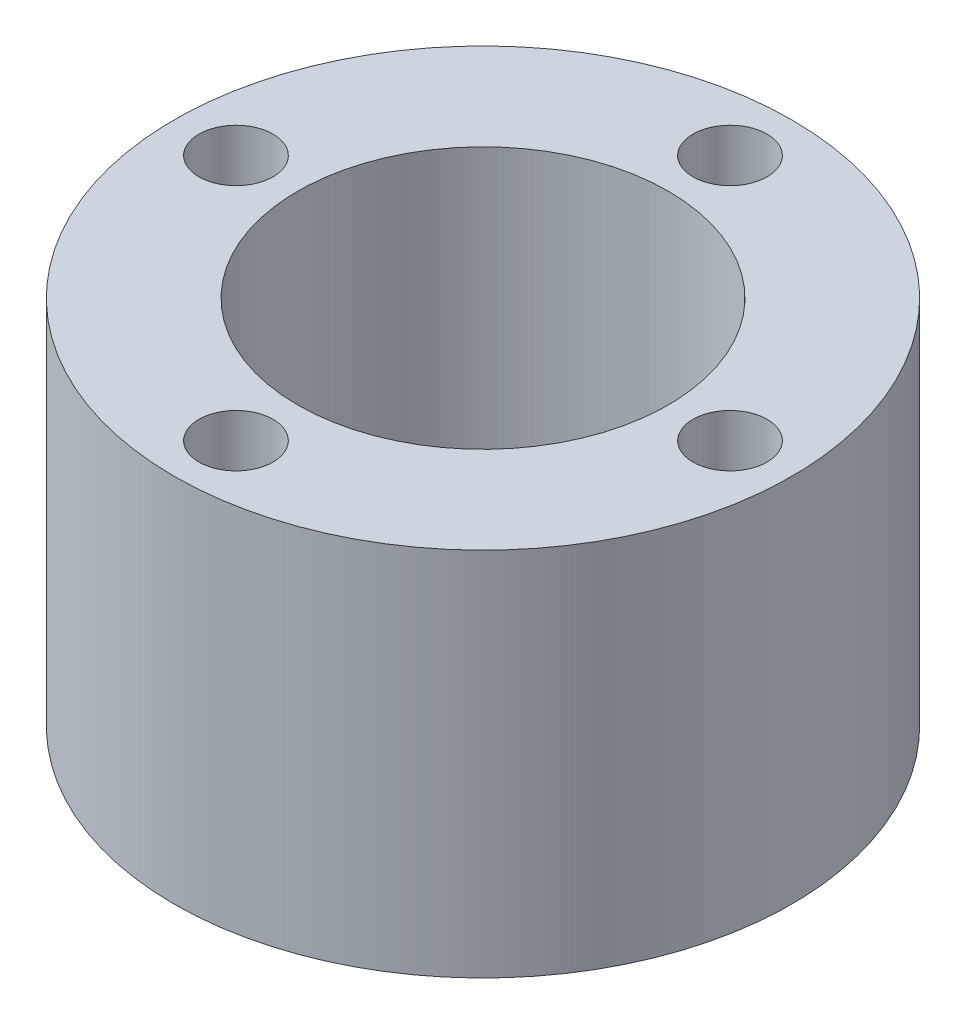
ISO-10303-21;
HEADER;
FILE_DESCRIPTION(('STEP AP214'),'2;1');
FILE_NAME('part.step','',(''),(''),'','','');
FILE_SCHEMA(('AUTOMOTIVE_DESIGN { 1 0 10303 214 1 1 1 1 }'));
ENDSEC;
DATA;
#1=APPLICATION_CONTEXT('core data for automotive mechanical design processes');
#2=APPLICATION_PROTOCOL_DEFINITION('international standard','automotive_design',2000,#1);
#3=PRODUCT_CONTEXT('',#1,'mechanical');
#4=PRODUCT('Part','Part','',(#3));
#5=PRODUCT_RELATED_PRODUCT_CATEGORY('part','',(#4));
#6=PRODUCT_DEFINITION_FORMATION('','',#4);
#7=PRODUCT_DEFINITION_CONTEXT('part definition',#1,'design');
#8=PRODUCT_DEFINITION('design','',#6,#7);
#9=PRODUCT_DEFINITION_SHAPE('','',#8);
#10=(LENGTH_UNIT() NAMED_UNIT(*) SI_UNIT(.MILLI.,.METRE.));
#11=(NAMED_UNIT(*) PLANE_ANGLE_UNIT() SI_UNIT($,.RADIAN.));
#12=(NAMED_UNIT(*) SI_UNIT($,.STERADIAN.) SOLID_ANGLE_UNIT());
#13=UNCERTAINTY_MEASURE_WITH_UNIT(LENGTH_MEASURE(1.E-05),#10,'distance_accuracy_value','');
#14=(GEOMETRIC_REPRESENTATION_CONTEXT(3) GLOBAL_UNCERTAINTY_ASSIGNED_CONTEXT((#13)) GLOBAL_UNIT_ASSIGNED_CONTEXT((#10,
#11,#12)) REPRESENTATION_CONTEXT('',''));
#15=CARTESIAN_POINT('',(0.,0.,0.));
#16=DIRECTION('',(0.,0.,1.));
#17=DIRECTION('',(1.,0.,0.));
#18=AXIS2_PLACEMENT_3D('',#15,#16,#17);
#19=CARTESIAN_POINT('',(0.,30.,0.));
#20=DIRECTION('',(0.,1.,0.));
#21=DIRECTION('',(0.,0.,1.));
#22=AXIS2_PLACEMENT_3D('',#19,#20,#21);
#23=PLANE('',#22);
#24=CARTESIAN_POINT('',(-20.,30.,0.));
#25=DIRECTION('',(0.,1.,0.));
#26=DIRECTION('',(0.,0.,1.));
#27=AXIS2_PLACEMENT_3D('',#24,#25,#26);
#28=CIRCLE('',#27,3.);
#29=CARTESIAN_POINT('',(-20.,30.,3.));
#30=VERTEX_POINT('',#29);
#31=EDGE_CURVE('E84',#30,#30,#28,.T.);
#32=ORIENTED_EDGE('',*,*,#31,.F.);
#33=EDGE_LOOP('',(#32));
#34=FACE_BOUND('',#33,.T.);
#35=CARTESIAN_POINT('',(0.,30.,-20.));
#36=DIRECTION('',(0.,1.,0.));
#37=DIRECTION('',(0.,0.,1.));
#38=AXIS2_PLACEMENT_3D('',#35,#36,#37);
#39=CIRCLE('',#38,3.);
#40=CARTESIAN_POINT('',(0.,30.,-17.));
#41=VERTEX_POINT('',#40);
#42=EDGE_CURVE('E80',#41,#41,#39,.T.);
#43=ORIENTED_EDGE('',*,*,#42,.F.);
#44=EDGE_LOOP('',(#43));
#45=FACE_BOUND('',#44,.T.);
#46=CARTESIAN_POINT('',(20.,30.,0.));
#47=DIRECTION('',(0.,1.,0.));
#48=DIRECTION('',(0.,0.,1.));
#49=AXIS2_PLACEMENT_3D('',#46,#47,#48);
#50=CIRCLE('',#49,3.);
#51=CARTESIAN_POINT('',(20.,30.,3.));
#52=VERTEX_POINT('',#51);
#53=EDGE_CURVE('E72',#52,#52,#50,.T.);
#54=ORIENTED_EDGE('',*,*,#53,.F.);
#55=EDGE_LOOP('',(#54));
#56=FACE_BOUND('',#55,.T.);
#57=CARTESIAN_POINT('',(0.,30.,20.));
#58=DIRECTION('',(0.,1.,0.));
#59=DIRECTION('',(0.,0.,1.));
#60=AXIS2_PLACEMENT_3D('',#57,#58,#59);
#61=CIRCLE('',#60,3.);
#62=CARTESIAN_POINT('',(0.,30.,23.));
#63=VERTEX_POINT('',#62);
#64=EDGE_CURVE('E64',#63,#63,#61,.T.);
#65=ORIENTED_EDGE('',*,*,#64,.F.);
#66=EDGE_LOOP('',(#65));
#67=FACE_BOUND('',#66,.T.);
#68=CARTESIAN_POINT('',(0.,30.,0.));
#69=DIRECTION('',(0.,1.,0.));
#70=DIRECTION('',(0.,0.,1.));
#71=AXIS2_PLACEMENT_3D('',#68,#69,#70);
#72=CIRCLE('',#71,25.);
#73=CARTESIAN_POINT('',(0.,30.,25.));
#74=VERTEX_POINT('',#73);
#75=EDGE_CURVE('E10',#74,#74,#72,.T.);
#76=ORIENTED_EDGE('',*,*,#75,.T.);
#77=EDGE_LOOP('',(#76));
#78=FACE_BOUND('',#77,.T.);
#79=CARTESIAN_POINT('',(0.,30.,0.));
#80=DIRECTION('',(0.,1.,0.));
#81=DIRECTION('',(0.,0.,1.));
#82=AXIS2_PLACEMENT_3D('',#79,#80,#81);
#83=CIRCLE('',#82,15.);
#84=CARTESIAN_POINT('',(0.,30.,15.));
#85=VERTEX_POINT('',#84);
#86=EDGE_CURVE('E50',#85,#85,#83,.T.);
#87=ORIENTED_EDGE('',*,*,#86,.F.);
#88=EDGE_LOOP('',(#87));
#89=FACE_BOUND('',#88,.T.);
#90=ADVANCED_FACE('F37',(#34,#45,#56,#67,#78,#89),#23,.T.);
#91=CARTESIAN_POINT('',(0.,0.,0.));
#92=DIRECTION('',(0.,1.,0.));
#93=DIRECTION('',(0.,0.,1.));
#94=AXIS2_PLACEMENT_3D('',#91,#92,#93);
#95=PLANE('',#94);
#96=CARTESIAN_POINT('',(-20.,0.,0.));
#97=DIRECTION('',(0.,1.,0.));
#98=DIRECTION('',(0.,0.,1.));
#99=AXIS2_PLACEMENT_3D('',#96,#97,#98);
#100=CIRCLE('',#99,3.);
#101=CARTESIAN_POINT('',(-20.,0.,3.));
#102=VERTEX_POINT('',#101);
#103=EDGE_CURVE('E56',#102,#102,#100,.T.);
#104=ORIENTED_EDGE('',*,*,#103,.T.);
#105=EDGE_LOOP('',(#104));
#106=FACE_BOUND('',#105,.T.);
#107=CARTESIAN_POINT('',(0.,0.,-20.));
#108=DIRECTION('',(0.,1.,0.));
#109=DIRECTION('',(0.,0.,1.));
#110=AXIS2_PLACEMENT_3D('',#107,#108,#109);
#111=CIRCLE('',#110,3.);
#112=CARTESIAN_POINT('',(0.,0.,-17.));
#113=VERTEX_POINT('',#112);
#114=EDGE_CURVE('E76',#113,#113,#111,.T.);
#115=ORIENTED_EDGE('',*,*,#114,.T.);
#116=EDGE_LOOP('',(#115));
#117=FACE_BOUND('',#116,.T.);
#118=CARTESIAN_POINT('',(20.,0.,0.));
#119=DIRECTION('',(0.,1.,0.));
#120=DIRECTION('',(0.,0.,1.));
#121=AXIS2_PLACEMENT_3D('',#118,#119,#120);
#122=CIRCLE('',#121,3.);
#123=CARTESIAN_POINT('',(20.,0.,3.));
#124=VERTEX_POINT('',#123);
#125=EDGE_CURVE('E68',#124,#124,#122,.T.);
#126=ORIENTED_EDGE('',*,*,#125,.T.);
#127=EDGE_LOOP('',(#126));
#128=FACE_BOUND('',#127,.T.);
#129=CARTESIAN_POINT('',(0.,0.,20.));
#130=DIRECTION('',(0.,1.,0.));
#131=DIRECTION('',(0.,0.,1.));
#132=AXIS2_PLACEMENT_3D('',#129,#130,#131);
#133=CIRCLE('',#132,3.);
#134=CARTESIAN_POINT('',(0.,0.,23.));
#135=VERTEX_POINT('',#134);
#136=EDGE_CURVE('E60',#135,#135,#133,.T.);
#137=ORIENTED_EDGE('',*,*,#136,.T.);
#138=EDGE_LOOP('',(#137));
#139=FACE_BOUND('',#138,.T.);
#140=CARTESIAN_POINT('',(0.,0.,0.));
#141=DIRECTION('',(0.,1.,0.));
#142=DIRECTION('',(0.,0.,1.));
#143=AXIS2_PLACEMENT_3D('',#140,#141,#142);
#144=CIRCLE('',#143,25.);
#145=CARTESIAN_POINT('',(0.,0.,25.));
#146=VERTEX_POINT('',#145);
#147=EDGE_CURVE('E41',#146,#146,#144,.T.);
#148=ORIENTED_EDGE('',*,*,#147,.F.);
#149=EDGE_LOOP('',(#148));
#150=FACE_BOUND('',#149,.T.);
#151=CARTESIAN_POINT('',(0.,0.,0.));
#152=DIRECTION('',(0.,1.,0.));
#153=DIRECTION('',(0.,0.,1.));
#154=AXIS2_PLACEMENT_3D('',#151,#152,#153);
#155=CIRCLE('',#154,15.);
#156=CARTESIAN_POINT('',(0.,0.,15.));
#157=VERTEX_POINT('',#156);
#158=EDGE_CURVE('E52',#157,#157,#155,.T.);
#159=ORIENTED_EDGE('',*,*,#158,.T.);
#160=EDGE_LOOP('',(#159));
#161=FACE_BOUND('',#160,.T.);
#162=ADVANCED_FACE('F92',(#106,#117,#128,#139,#150,#161),#95,.F.);
#163=CARTESIAN_POINT('',(0.,30.,0.));
#164=DIRECTION('',(0.,-1.,0.));
#165=DIRECTION('',(0.,0.,-1.));
#166=AXIS2_PLACEMENT_3D('',#163,#164,#165);
#167=CYLINDRICAL_SURFACE('',#166,25.);
#168=ORIENTED_EDGE('',*,*,#75,.F.);
#169=EDGE_LOOP('',(#168));
#170=FACE_BOUND('',#169,.T.);
#171=ORIENTED_EDGE('',*,*,#147,.T.);
#172=EDGE_LOOP('',(#171));
#173=FACE_BOUND('',#172,.T.);
#174=ADVANCED_FACE('F39',(#170,#173),#167,.T.);
#175=CARTESIAN_POINT('',(0.,30.,0.));
#176=DIRECTION('',(0.,-1.,0.));
#177=DIRECTION('',(0.,0.,-1.));
#178=AXIS2_PLACEMENT_3D('',#175,#176,#177);
#179=CYLINDRICAL_SURFACE('',#178,15.);
#180=ORIENTED_EDGE('',*,*,#86,.T.);
#181=EDGE_LOOP('',(#180));
#182=FACE_BOUND('',#181,.T.);
#183=ORIENTED_EDGE('',*,*,#158,.F.);
#184=EDGE_LOOP('',(#183));
#185=FACE_BOUND('',#184,.T.);
#186=ADVANCED_FACE('F113',(#182,#185),#179,.F.);
#187=CARTESIAN_POINT('',(0.,0.,20.));
#188=DIRECTION('',(0.,1.,0.));
#189=DIRECTION('',(0.,0.,1.));
#190=AXIS2_PLACEMENT_3D('',#187,#188,#189);
#191=CYLINDRICAL_SURFACE('',#190,3.);
#192=ORIENTED_EDGE('',*,*,#136,.F.);
#193=EDGE_LOOP('',(#192));
#194=FACE_BOUND('',#193,.T.);
#195=ORIENTED_EDGE('',*,*,#64,.T.);
#196=EDGE_LOOP('',(#195));
#197=FACE_BOUND('',#196,.T.);
#198=ADVANCED_FACE('F116',(#194,#197),#191,.F.);
#199=CARTESIAN_POINT('',(20.,0.,0.));
#200=DIRECTION('',(0.,1.,0.));
#201=DIRECTION('',(0.,0.,1.));
#202=AXIS2_PLACEMENT_3D('',#199,#200,#201);
#203=CYLINDRICAL_SURFACE('',#202,3.);
#204=ORIENTED_EDGE('',*,*,#125,.F.);
#205=EDGE_LOOP('',(#204));
#206=FACE_BOUND('',#205,.T.);
#207=ORIENTED_EDGE('',*,*,#53,.T.);
#208=EDGE_LOOP('',(#207));
#209=FACE_BOUND('',#208,.T.);
#210=ADVANCED_FACE('F128',(#206,#209),#203,.F.);
#211=CARTESIAN_POINT('',(0.,0.,-20.));
#212=DIRECTION('',(0.,1.,0.));
#213=DIRECTION('',(0.,0.,1.));
#214=AXIS2_PLACEMENT_3D('',#211,#212,#213);
#215=CYLINDRICAL_SURFACE('',#214,3.);
#216=ORIENTED_EDGE('',*,*,#114,.F.);
#217=EDGE_LOOP('',(#216));
#218=FACE_BOUND('',#217,.T.);
#219=ORIENTED_EDGE('',*,*,#42,.T.);
#220=EDGE_LOOP('',(#219));
#221=FACE_BOUND('',#220,.T.);
#222=ADVANCED_FACE('F98',(#218,#221),#215,.F.);
#223=CARTESIAN_POINT('',(-20.,0.,0.));
#224=DIRECTION('',(0.,1.,0.));
#225=DIRECTION('',(0.,0.,1.));
#226=AXIS2_PLACEMENT_3D('',#223,#224,#225);
#227=CYLINDRICAL_SURFACE('',#226,3.);
#228=ORIENTED_EDGE('',*,*,#103,.F.);
#229=EDGE_LOOP('',(#228));
#230=FACE_BOUND('',#229,.T.);
#231=ORIENTED_EDGE('',*,*,#31,.T.);
#232=EDGE_LOOP('',(#231));
#233=FACE_BOUND('',#232,.T.);
#234=ADVANCED_FACE('F95',(#230,#233),#227,.F.);
#235=CLOSED_SHELL('',(#90,#162,#174,#186,#198,#210,#222,#234));
#236=MANIFOLD_SOLID_BREP('B2',#235);
#237=ADVANCED_BREP_SHAPE_REPRESENTATION('',(#18,#236),#14);
#238=SHAPE_DEFINITION_REPRESENTATION(#9,#237);
ENDSEC;
END-ISO-10303-21;
